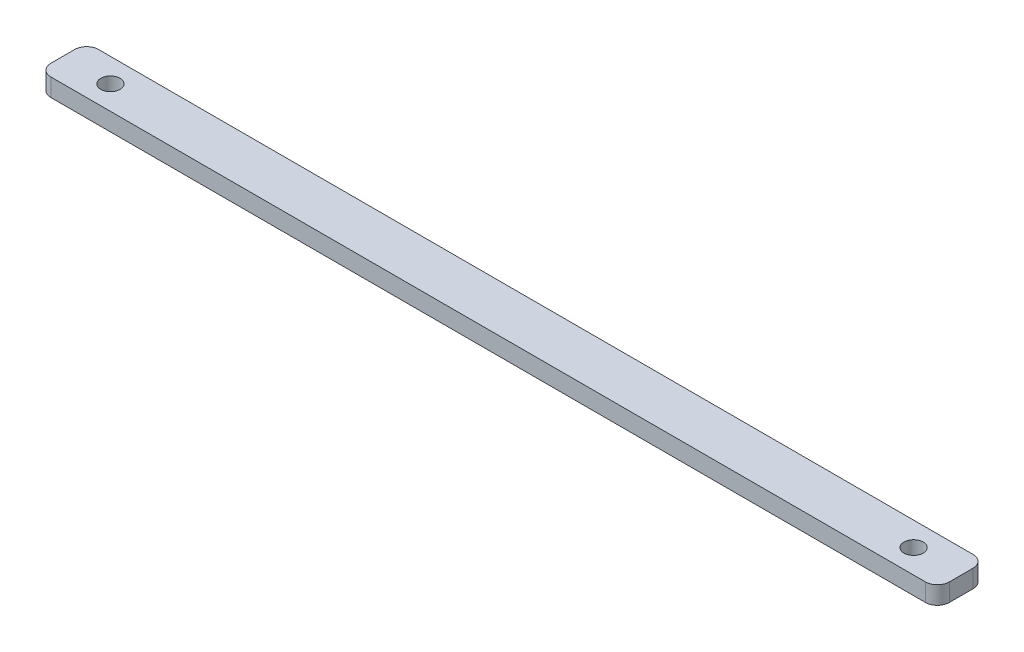
ISO-10303-21;
HEADER;
FILE_DESCRIPTION(('STEP AP214'),'2;1');
FILE_NAME('part.step','',(''),(''),'','','');
FILE_SCHEMA(('AUTOMOTIVE_DESIGN { 1 0 10303 214 1 1 1 1 }'));
ENDSEC;
DATA;
#1=APPLICATION_CONTEXT('core data for automotive mechanical design processes');
#2=APPLICATION_PROTOCOL_DEFINITION('international standard','automotive_design',2000,#1);
#3=PRODUCT_CONTEXT('',#1,'mechanical');
#4=PRODUCT('Part','Part','',(#3));
#5=PRODUCT_RELATED_PRODUCT_CATEGORY('part','',(#4));
#6=PRODUCT_DEFINITION_FORMATION('','',#4);
#7=PRODUCT_DEFINITION_CONTEXT('part definition',#1,'design');
#8=PRODUCT_DEFINITION('design','',#6,#7);
#9=PRODUCT_DEFINITION_SHAPE('','',#8);
#10=(LENGTH_UNIT() NAMED_UNIT(*) SI_UNIT(.MILLI.,.METRE.));
#11=(NAMED_UNIT(*) PLANE_ANGLE_UNIT() SI_UNIT($,.RADIAN.));
#12=(NAMED_UNIT(*) SI_UNIT($,.STERADIAN.) SOLID_ANGLE_UNIT());
#13=UNCERTAINTY_MEASURE_WITH_UNIT(LENGTH_MEASURE(1.E-05),#10,'distance_accuracy_value','');
#14=(GEOMETRIC_REPRESENTATION_CONTEXT(3) GLOBAL_UNCERTAINTY_ASSIGNED_CONTEXT((#13)) GLOBAL_UNIT_ASSIGNED_CONTEXT((#10,
#11,#12)) REPRESENTATION_CONTEXT('',''));
#15=CARTESIAN_POINT('',(0.,0.,0.));
#16=DIRECTION('',(0.,0.,1.));
#17=DIRECTION('',(1.,0.,0.));
#18=AXIS2_PLACEMENT_3D('',#15,#16,#17);
#19=CARTESIAN_POINT('',(0.,3.,0.));
#20=DIRECTION('',(0.,1.,0.));
#21=DIRECTION('',(0.,0.,1.));
#22=AXIS2_PLACEMENT_3D('',#19,#20,#21);
#23=PLANE('',#22);
#24=CARTESIAN_POINT('',(-67.5,3.,0.));
#25=DIRECTION('',(0.,1.,0.));
#26=DIRECTION('',(0.,0.,1.));
#27=AXIS2_PLACEMENT_3D('',#24,#25,#26);
#28=CIRCLE('',#27,1.621);
#29=CARTESIAN_POINT('',(-67.5,3.,1.62100000000002));
#30=VERTEX_POINT('',#29);
#31=EDGE_CURVE('E146',#30,#30,#28,.T.);
#32=ORIENTED_EDGE('',*,*,#31,.F.);
#33=EDGE_LOOP('',(#32));
#34=FACE_BOUND('',#33,.T.);
#35=DIRECTION('',(0.,0.,1.));
#36=VECTOR('',#35,1.);
#37=CARTESIAN_POINT('',(-75.5,3.,4.00000000000002));
#38=LINE('',#37,#36);
#39=CARTESIAN_POINT('',(-75.5,3.,-1.99999999999998));
#40=VERTEX_POINT('',#39);
#41=CARTESIAN_POINT('',(-75.5,3.,2.00000000000002));
#42=VERTEX_POINT('',#41);
#43=EDGE_CURVE('E152',#40,#42,#38,.T.);
#44=ORIENTED_EDGE('',*,*,#43,.T.);
#45=CARTESIAN_POINT('',(-73.5,3.,2.00000000000002));
#46=DIRECTION('',(0.,1.,0.));
#47=DIRECTION('',(0.,0.,1.));
#48=AXIS2_PLACEMENT_3D('',#45,#46,#47);
#49=CIRCLE('',#48,2.);
#50=CARTESIAN_POINT('',(-73.5,3.,4.00000000000002));
#51=VERTEX_POINT('',#50);
#52=EDGE_CURVE('E176',#42,#51,#49,.T.);
#53=ORIENTED_EDGE('',*,*,#52,.T.);
#54=DIRECTION('',(1.,0.,0.));
#55=VECTOR('',#54,1.);
#56=CARTESIAN_POINT('',(75.5,3.,4.));
#57=LINE('',#56,#55);
#58=CARTESIAN_POINT('',(73.5,3.,4.));
#59=VERTEX_POINT('',#58);
#60=EDGE_CURVE('E129',#51,#59,#57,.T.);
#61=ORIENTED_EDGE('',*,*,#60,.T.);
#62=CARTESIAN_POINT('',(73.5,3.,2.));
#63=DIRECTION('',(0.,1.,0.));
#64=DIRECTION('',(0.,0.,1.));
#65=AXIS2_PLACEMENT_3D('',#62,#63,#64);
#66=CIRCLE('',#65,2.);
#67=CARTESIAN_POINT('',(75.5,3.,2.));
#68=VERTEX_POINT('',#67);
#69=EDGE_CURVE('E168',#59,#68,#66,.T.);
#70=ORIENTED_EDGE('',*,*,#69,.T.);
#71=DIRECTION('',(0.,0.,-1.));
#72=VECTOR('',#71,1.);
#73=CARTESIAN_POINT('',(75.5,3.,4.));
#74=LINE('',#73,#72);
#75=CARTESIAN_POINT('',(75.5,3.,-2.));
#76=VERTEX_POINT('',#75);
#77=EDGE_CURVE('E191',#68,#76,#74,.T.);
#78=ORIENTED_EDGE('',*,*,#77,.T.);
#79=CARTESIAN_POINT('',(73.5,3.,-2.));
#80=DIRECTION('',(0.,1.,0.));
#81=DIRECTION('',(0.,0.,1.));
#82=AXIS2_PLACEMENT_3D('',#79,#80,#81);
#83=CIRCLE('',#82,2.);
#84=CARTESIAN_POINT('',(73.5,3.,-4.));
#85=VERTEX_POINT('',#84);
#86=EDGE_CURVE('E64',#76,#85,#83,.T.);
#87=ORIENTED_EDGE('',*,*,#86,.T.);
#88=DIRECTION('',(-1.,0.,0.));
#89=VECTOR('',#88,1.);
#90=CARTESIAN_POINT('',(75.5,3.,-4.));
#91=LINE('',#90,#89);
#92=CARTESIAN_POINT('',(-73.5,3.,-3.99999999999998));
#93=VERTEX_POINT('',#92);
#94=EDGE_CURVE('E154',#85,#93,#91,.T.);
#95=ORIENTED_EDGE('',*,*,#94,.T.);
#96=CARTESIAN_POINT('',(-73.5,3.,-1.99999999999998));
#97=DIRECTION('',(0.,1.,0.));
#98=DIRECTION('',(0.,0.,1.));
#99=AXIS2_PLACEMENT_3D('',#96,#97,#98);
#100=CIRCLE('',#99,2.);
#101=EDGE_CURVE('E173',#93,#40,#100,.T.);
#102=ORIENTED_EDGE('',*,*,#101,.T.);
#103=EDGE_LOOP('',(#44,#53,#61,#70,#78,#87,#95,#102));
#104=FACE_BOUND('',#103,.T.);
#105=CARTESIAN_POINT('',(67.5,3.,0.));
#106=DIRECTION('',(0.,1.,0.));
#107=DIRECTION('',(0.,0.,1.));
#108=AXIS2_PLACEMENT_3D('',#105,#106,#107);
#109=CIRCLE('',#108,1.621);
#110=CARTESIAN_POINT('',(67.5,3.,1.62100000000001));
#111=VERTEX_POINT('',#110);
#112=EDGE_CURVE('E213',#111,#111,#109,.T.);
#113=ORIENTED_EDGE('',*,*,#112,.F.);
#114=EDGE_LOOP('',(#113));
#115=FACE_BOUND('',#114,.T.);
#116=ADVANCED_FACE('F41',(#34,#104,#115),#23,.T.);
#117=CARTESIAN_POINT('',(0.,0.,0.));
#118=DIRECTION('',(0.,1.,0.));
#119=DIRECTION('',(0.,0.,1.));
#120=AXIS2_PLACEMENT_3D('',#117,#118,#119);
#121=PLANE('',#120);
#122=DIRECTION('',(1.,0.,0.));
#123=VECTOR('',#122,1.);
#124=CARTESIAN_POINT('',(75.5,0.,4.));
#125=LINE('',#124,#123);
#126=CARTESIAN_POINT('',(-73.5,0.,4.00000000000002));
#127=VERTEX_POINT('',#126);
#128=CARTESIAN_POINT('',(73.5,0.,4.));
#129=VERTEX_POINT('',#128);
#130=EDGE_CURVE('E126',#127,#129,#125,.T.);
#131=ORIENTED_EDGE('',*,*,#130,.F.);
#132=CARTESIAN_POINT('',(-73.5,0.,2.00000000000002));
#133=DIRECTION('',(0.,1.,0.));
#134=DIRECTION('',(0.,0.,1.));
#135=AXIS2_PLACEMENT_3D('',#132,#133,#134);
#136=CIRCLE('',#135,2.);
#137=CARTESIAN_POINT('',(-75.5,0.,2.00000000000002));
#138=VERTEX_POINT('',#137);
#139=EDGE_CURVE('E108',#127,#138,#136,.F.);
#140=ORIENTED_EDGE('',*,*,#139,.T.);
#141=DIRECTION('',(0.,0.,1.));
#142=VECTOR('',#141,1.);
#143=CARTESIAN_POINT('',(-75.5,0.,4.00000000000002));
#144=LINE('',#143,#142);
#145=CARTESIAN_POINT('',(-75.5,0.,-1.99999999999998));
#146=VERTEX_POINT('',#145);
#147=EDGE_CURVE('E139',#146,#138,#144,.T.);
#148=ORIENTED_EDGE('',*,*,#147,.F.);
#149=CARTESIAN_POINT('',(-73.5,0.,-1.99999999999998));
#150=DIRECTION('',(0.,1.,0.));
#151=DIRECTION('',(0.,0.,1.));
#152=AXIS2_PLACEMENT_3D('',#149,#150,#151);
#153=CIRCLE('',#152,2.);
#154=CARTESIAN_POINT('',(-73.5,0.,-3.99999999999998));
#155=VERTEX_POINT('',#154);
#156=EDGE_CURVE('E120',#146,#155,#153,.F.);
#157=ORIENTED_EDGE('',*,*,#156,.T.);
#158=DIRECTION('',(-1.,0.,0.));
#159=VECTOR('',#158,1.);
#160=CARTESIAN_POINT('',(75.5,0.,-4.));
#161=LINE('',#160,#159);
#162=CARTESIAN_POINT('',(73.5,0.,-4.));
#163=VERTEX_POINT('',#162);
#164=EDGE_CURVE('E144',#163,#155,#161,.T.);
#165=ORIENTED_EDGE('',*,*,#164,.F.);
#166=CARTESIAN_POINT('',(73.5,0.,-2.));
#167=DIRECTION('',(0.,1.,0.));
#168=DIRECTION('',(0.,0.,1.));
#169=AXIS2_PLACEMENT_3D('',#166,#167,#168);
#170=CIRCLE('',#169,2.);
#171=CARTESIAN_POINT('',(75.5,0.,-2.));
#172=VERTEX_POINT('',#171);
#173=EDGE_CURVE('E158',#163,#172,#170,.F.);
#174=ORIENTED_EDGE('',*,*,#173,.T.);
#175=DIRECTION('',(0.,0.,-1.));
#176=VECTOR('',#175,1.);
#177=CARTESIAN_POINT('',(75.5,0.,4.));
#178=LINE('',#177,#176);
#179=CARTESIAN_POINT('',(75.5,0.,2.));
#180=VERTEX_POINT('',#179);
#181=EDGE_CURVE('E138',#180,#172,#178,.T.);
#182=ORIENTED_EDGE('',*,*,#181,.F.);
#183=CARTESIAN_POINT('',(73.5,0.,2.));
#184=DIRECTION('',(0.,1.,0.));
#185=DIRECTION('',(0.,0.,1.));
#186=AXIS2_PLACEMENT_3D('',#183,#184,#185);
#187=CIRCLE('',#186,2.);
#188=EDGE_CURVE('E131',#180,#129,#187,.F.);
#189=ORIENTED_EDGE('',*,*,#188,.T.);
#190=EDGE_LOOP('',(#131,#140,#148,#157,#165,#174,#182,#189));
#191=FACE_BOUND('',#190,.T.);
#192=CARTESIAN_POINT('',(-67.5,0.,0.));
#193=DIRECTION('',(0.,1.,0.));
#194=DIRECTION('',(0.,0.,1.));
#195=AXIS2_PLACEMENT_3D('',#192,#193,#194);
#196=CIRCLE('',#195,1.621);
#197=CARTESIAN_POINT('',(-67.5,0.,1.62100000000002));
#198=VERTEX_POINT('',#197);
#199=EDGE_CURVE('E209',#198,#198,#196,.T.);
#200=ORIENTED_EDGE('',*,*,#199,.T.);
#201=EDGE_LOOP('',(#200));
#202=FACE_BOUND('',#201,.T.);
#203=CARTESIAN_POINT('',(67.5,0.,0.));
#204=DIRECTION('',(0.,1.,0.));
#205=DIRECTION('',(0.,0.,1.));
#206=AXIS2_PLACEMENT_3D('',#203,#204,#205);
#207=CIRCLE('',#206,1.621);
#208=CARTESIAN_POINT('',(67.5,0.,1.62100000000001));
#209=VERTEX_POINT('',#208);
#210=EDGE_CURVE('E217',#209,#209,#207,.T.);
#211=ORIENTED_EDGE('',*,*,#210,.T.);
#212=EDGE_LOOP('',(#211));
#213=FACE_BOUND('',#212,.T.);
#214=ADVANCED_FACE('F134',(#191,#202,#213),#121,.F.);
#215=CARTESIAN_POINT('',(-75.5,3.,4.00000000000002));
#216=DIRECTION('',(1.,0.,0.));
#217=DIRECTION('',(0.,0.,-1.));
#218=AXIS2_PLACEMENT_3D('',#215,#216,#217);
#219=PLANE('',#218);
#220=ORIENTED_EDGE('',*,*,#147,.T.);
#221=DIRECTION('',(0.,-1.,0.));
#222=VECTOR('',#221,1.);
#223=CARTESIAN_POINT('',(-75.5,3.,2.00000000000002));
#224=LINE('',#223,#222);
#225=EDGE_CURVE('E113',#138,#42,#224,.F.);
#226=ORIENTED_EDGE('',*,*,#225,.T.);
#227=ORIENTED_EDGE('',*,*,#43,.F.);
#228=DIRECTION('',(0.,-1.,0.));
#229=VECTOR('',#228,1.);
#230=CARTESIAN_POINT('',(-75.5,3.,-1.99999999999998));
#231=LINE('',#230,#229);
#232=EDGE_CURVE('E119',#40,#146,#231,.T.);
#233=ORIENTED_EDGE('',*,*,#232,.T.);
#234=EDGE_LOOP('',(#220,#226,#227,#233));
#235=FACE_BOUND('',#234,.T.);
#236=ADVANCED_FACE('F234',(#235),#219,.F.);
#237=CARTESIAN_POINT('',(75.5,3.,4.));
#238=DIRECTION('',(0.,0.,-1.));
#239=DIRECTION('',(-1.,0.,0.));
#240=AXIS2_PLACEMENT_3D('',#237,#238,#239);
#241=PLANE('',#240);
#242=ORIENTED_EDGE('',*,*,#60,.F.);
#243=DIRECTION('',(0.,-1.,0.));
#244=VECTOR('',#243,1.);
#245=CARTESIAN_POINT('',(-73.5,3.,4.00000000000002));
#246=LINE('',#245,#244);
#247=EDGE_CURVE('E112',#51,#127,#246,.T.);
#248=ORIENTED_EDGE('',*,*,#247,.T.);
#249=ORIENTED_EDGE('',*,*,#130,.T.);
#250=DIRECTION('',(0.,-1.,0.));
#251=VECTOR('',#250,1.);
#252=CARTESIAN_POINT('',(73.5,3.,4.));
#253=LINE('',#252,#251);
#254=EDGE_CURVE('E132',#129,#59,#253,.F.);
#255=ORIENTED_EDGE('',*,*,#254,.T.);
#256=EDGE_LOOP('',(#242,#248,#249,#255));
#257=FACE_BOUND('',#256,.T.);
#258=ADVANCED_FACE('F125',(#257),#241,.F.);
#259=CARTESIAN_POINT('',(75.5,3.,4.));
#260=DIRECTION('',(-1.,0.,0.));
#261=DIRECTION('',(0.,0.,1.));
#262=AXIS2_PLACEMENT_3D('',#259,#260,#261);
#263=PLANE('',#262);
#264=ORIENTED_EDGE('',*,*,#181,.T.);
#265=DIRECTION('',(0.,-1.,0.));
#266=VECTOR('',#265,1.);
#267=CARTESIAN_POINT('',(75.5,3.,-2.));
#268=LINE('',#267,#266);
#269=EDGE_CURVE('E11',#172,#76,#268,.F.);
#270=ORIENTED_EDGE('',*,*,#269,.T.);
#271=ORIENTED_EDGE('',*,*,#77,.F.);
#272=DIRECTION('',(0.,-1.,0.));
#273=VECTOR('',#272,1.);
#274=CARTESIAN_POINT('',(75.5,3.,2.));
#275=LINE('',#274,#273);
#276=EDGE_CURVE('E50',#68,#180,#275,.T.);
#277=ORIENTED_EDGE('',*,*,#276,.T.);
#278=EDGE_LOOP('',(#264,#270,#271,#277));
#279=FACE_BOUND('',#278,.T.);
#280=ADVANCED_FACE('F189',(#279),#263,.F.);
#281=CARTESIAN_POINT('',(75.5,3.,-4.));
#282=DIRECTION('',(0.,0.,1.));
#283=DIRECTION('',(1.,0.,0.));
#284=AXIS2_PLACEMENT_3D('',#281,#282,#283);
#285=PLANE('',#284);
#286=ORIENTED_EDGE('',*,*,#164,.T.);
#287=DIRECTION('',(0.,-1.,0.));
#288=VECTOR('',#287,1.);
#289=CARTESIAN_POINT('',(-73.5,3.,-3.99999999999998));
#290=LINE('',#289,#288);
#291=EDGE_CURVE('E57',#155,#93,#290,.F.);
#292=ORIENTED_EDGE('',*,*,#291,.T.);
#293=ORIENTED_EDGE('',*,*,#94,.F.);
#294=DIRECTION('',(0.,-1.,0.));
#295=VECTOR('',#294,1.);
#296=CARTESIAN_POINT('',(73.5,3.,-4.));
#297=LINE('',#296,#295);
#298=EDGE_CURVE('E179',#85,#163,#297,.T.);
#299=ORIENTED_EDGE('',*,*,#298,.T.);
#300=EDGE_LOOP('',(#286,#292,#293,#299));
#301=FACE_BOUND('',#300,.T.);
#302=ADVANCED_FACE('F198',(#301),#285,.F.);
#303=CARTESIAN_POINT('',(-67.5,3.,0.));
#304=DIRECTION('',(0.,-1.,0.));
#305=DIRECTION('',(0.,0.,-1.));
#306=AXIS2_PLACEMENT_3D('',#303,#304,#305);
#307=CYLINDRICAL_SURFACE('',#306,1.621);
#308=ORIENTED_EDGE('',*,*,#31,.T.);
#309=EDGE_LOOP('',(#308));
#310=FACE_BOUND('',#309,.T.);
#311=ORIENTED_EDGE('',*,*,#199,.F.);
#312=EDGE_LOOP('',(#311));
#313=FACE_BOUND('',#312,.T.);
#314=ADVANCED_FACE('F238',(#310,#313),#307,.F.);
#315=CARTESIAN_POINT('',(67.5,3.,0.));
#316=DIRECTION('',(0.,-1.,0.));
#317=DIRECTION('',(0.,0.,-1.));
#318=AXIS2_PLACEMENT_3D('',#315,#316,#317);
#319=CYLINDRICAL_SURFACE('',#318,1.621);
#320=ORIENTED_EDGE('',*,*,#112,.T.);
#321=EDGE_LOOP('',(#320));
#322=FACE_BOUND('',#321,.T.);
#323=ORIENTED_EDGE('',*,*,#210,.F.);
#324=EDGE_LOOP('',(#323));
#325=FACE_BOUND('',#324,.T.);
#326=ADVANCED_FACE('F225',(#322,#325),#319,.F.);
#327=CARTESIAN_POINT('',(-73.5,3.,2.00000000000002));
#328=DIRECTION('',(0.,-1.,0.));
#329=DIRECTION('',(0.,0.,-1.));
#330=AXIS2_PLACEMENT_3D('',#327,#328,#329);
#331=CYLINDRICAL_SURFACE('',#330,2.);
#332=ORIENTED_EDGE('',*,*,#52,.F.);
#333=ORIENTED_EDGE('',*,*,#225,.F.);
#334=ORIENTED_EDGE('',*,*,#139,.F.);
#335=ORIENTED_EDGE('',*,*,#247,.F.);
#336=EDGE_LOOP('',(#332,#333,#334,#335));
#337=FACE_BOUND('',#336,.T.);
#338=ADVANCED_FACE('F111',(#337),#331,.T.);
#339=CARTESIAN_POINT('',(-73.5,3.,-1.99999999999998));
#340=DIRECTION('',(0.,-1.,0.));
#341=DIRECTION('',(0.,0.,-1.));
#342=AXIS2_PLACEMENT_3D('',#339,#340,#341);
#343=CYLINDRICAL_SURFACE('',#342,2.);
#344=ORIENTED_EDGE('',*,*,#101,.F.);
#345=ORIENTED_EDGE('',*,*,#291,.F.);
#346=ORIENTED_EDGE('',*,*,#156,.F.);
#347=ORIENTED_EDGE('',*,*,#232,.F.);
#348=EDGE_LOOP('',(#344,#345,#346,#347));
#349=FACE_BOUND('',#348,.T.);
#350=ADVANCED_FACE('F252',(#349),#343,.T.);
#351=CARTESIAN_POINT('',(73.5,3.,-2.));
#352=DIRECTION('',(0.,-1.,0.));
#353=DIRECTION('',(0.,0.,-1.));
#354=AXIS2_PLACEMENT_3D('',#351,#352,#353);
#355=CYLINDRICAL_SURFACE('',#354,2.);
#356=ORIENTED_EDGE('',*,*,#86,.F.);
#357=ORIENTED_EDGE('',*,*,#269,.F.);
#358=ORIENTED_EDGE('',*,*,#173,.F.);
#359=ORIENTED_EDGE('',*,*,#298,.F.);
#360=EDGE_LOOP('',(#356,#357,#358,#359));
#361=FACE_BOUND('',#360,.T.);
#362=ADVANCED_FACE('F197',(#361),#355,.T.);
#363=CARTESIAN_POINT('',(73.5,3.,2.));
#364=DIRECTION('',(0.,-1.,0.));
#365=DIRECTION('',(0.,0.,-1.));
#366=AXIS2_PLACEMENT_3D('',#363,#364,#365);
#367=CYLINDRICAL_SURFACE('',#366,2.);
#368=ORIENTED_EDGE('',*,*,#69,.F.);
#369=ORIENTED_EDGE('',*,*,#254,.F.);
#370=ORIENTED_EDGE('',*,*,#188,.F.);
#371=ORIENTED_EDGE('',*,*,#276,.F.);
#372=EDGE_LOOP('',(#368,#369,#370,#371));
#373=FACE_BOUND('',#372,.T.);
#374=ADVANCED_FACE('F43',(#373),#367,.T.);
#375=CLOSED_SHELL('',(#116,#214,#236,#258,#280,#302,#314,#326,#338,#350,#362,#374));
#376=MANIFOLD_SOLID_BREP('B2',#375);
#377=ADVANCED_BREP_SHAPE_REPRESENTATION('',(#18,#376),#14);
#378=SHAPE_DEFINITION_REPRESENTATION(#9,#377);
ENDSEC;
END-ISO-10303-21;
